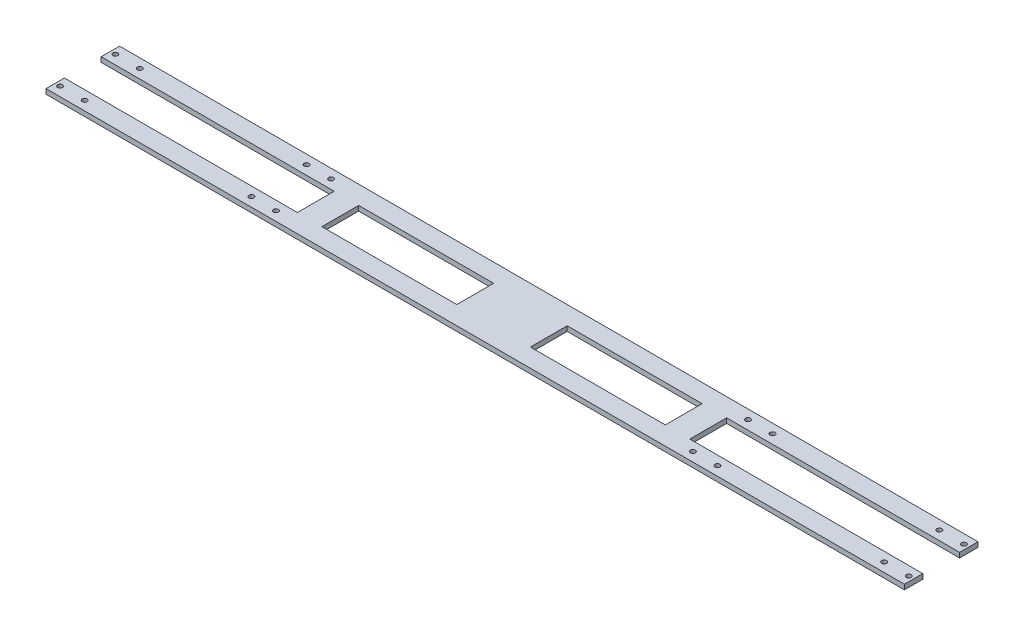
ISO-10303-21;
HEADER;
FILE_DESCRIPTION(('STEP AP214'),'2;1');
FILE_NAME('part.step','',(''),(''),'','','');
FILE_SCHEMA(('AUTOMOTIVE_DESIGN { 1 0 10303 214 1 1 1 1 }'));
ENDSEC;
DATA;
#1=APPLICATION_CONTEXT('core data for automotive mechanical design processes');
#2=APPLICATION_PROTOCOL_DEFINITION('international standard','automotive_design',2000,#1);
#3=PRODUCT_CONTEXT('',#1,'mechanical');
#4=PRODUCT('Part','Part','',(#3));
#5=PRODUCT_RELATED_PRODUCT_CATEGORY('part','',(#4));
#6=PRODUCT_DEFINITION_FORMATION('','',#4);
#7=PRODUCT_DEFINITION_CONTEXT('part definition',#1,'design');
#8=PRODUCT_DEFINITION('design','',#6,#7);
#9=PRODUCT_DEFINITION_SHAPE('','',#8);
#10=(LENGTH_UNIT() NAMED_UNIT(*) SI_UNIT(.MILLI.,.METRE.));
#11=(NAMED_UNIT(*) PLANE_ANGLE_UNIT() SI_UNIT($,.RADIAN.));
#12=(NAMED_UNIT(*) SI_UNIT($,.STERADIAN.) SOLID_ANGLE_UNIT());
#13=UNCERTAINTY_MEASURE_WITH_UNIT(LENGTH_MEASURE(1.E-05),#10,'distance_accuracy_value','');
#14=(GEOMETRIC_REPRESENTATION_CONTEXT(3) GLOBAL_UNCERTAINTY_ASSIGNED_CONTEXT((#13)) GLOBAL_UNIT_ASSIGNED_CONTEXT((#10,
#11,#12)) REPRESENTATION_CONTEXT('',''));
#15=CARTESIAN_POINT('',(0.,0.,0.));
#16=DIRECTION('',(0.,0.,1.));
#17=DIRECTION('',(1.,0.,0.));
#18=AXIS2_PLACEMENT_3D('',#15,#16,#17);
#19=CARTESIAN_POINT('',(-140.,4.,-15.));
#20=DIRECTION('',(0.,0.,1.));
#21=DIRECTION('',(1.,0.,0.));
#22=AXIS2_PLACEMENT_3D('',#19,#20,#21);
#23=PLANE('',#22);
#24=DIRECTION('',(0.,1.,0.));
#25=VECTOR('',#24,1.);
#26=CARTESIAN_POINT('',(30.,0.,-15.));
#27=LINE('',#26,#25);
#28=CARTESIAN_POINT('',(30.,0.,-15.));
#29=VERTEX_POINT('',#28);
#30=CARTESIAN_POINT('',(30.,4.,-15.));
#31=VERTEX_POINT('',#30);
#32=EDGE_CURVE('E197',#29,#31,#27,.T.);
#33=ORIENTED_EDGE('',*,*,#32,.F.);
#34=DIRECTION('',(-1.,0.,0.));
#35=VECTOR('',#34,1.);
#36=CARTESIAN_POINT('',(-140.,0.,-15.));
#37=LINE('',#36,#35);
#38=CARTESIAN_POINT('',(140.,0.,-15.));
#39=VERTEX_POINT('',#38);
#40=EDGE_CURVE('E372',#39,#29,#37,.T.);
#41=ORIENTED_EDGE('',*,*,#40,.F.);
#42=DIRECTION('',(0.,-1.,0.));
#43=VECTOR('',#42,1.);
#44=CARTESIAN_POINT('',(140.,4.,-15.));
#45=LINE('',#44,#43);
#46=CARTESIAN_POINT('',(140.,4.,-15.));
#47=VERTEX_POINT('',#46);
#48=EDGE_CURVE('E387',#47,#39,#45,.T.);
#49=ORIENTED_EDGE('',*,*,#48,.F.);
#50=DIRECTION('',(-1.,0.,0.));
#51=VECTOR('',#50,1.);
#52=CARTESIAN_POINT('',(-140.,4.,-15.));
#53=LINE('',#52,#51);
#54=EDGE_CURVE('E56',#47,#31,#53,.T.);
#55=ORIENTED_EDGE('',*,*,#54,.T.);
#56=EDGE_LOOP('',(#33,#41,#49,#55));
#57=FACE_BOUND('',#56,.T.);
#58=ADVANCED_FACE('F41',(#57),#23,.T.);
#59=CARTESIAN_POINT('',(-140.,4.,15.));
#60=DIRECTION('',(0.,0.,-1.));
#61=DIRECTION('',(-1.,0.,0.));
#62=AXIS2_PLACEMENT_3D('',#59,#60,#61);
#63=PLANE('',#62);
#64=DIRECTION('',(0.,1.,0.));
#65=VECTOR('',#64,1.);
#66=CARTESIAN_POINT('',(30.,0.,15.));
#67=LINE('',#66,#65);
#68=CARTESIAN_POINT('',(30.,0.,15.));
#69=VERTEX_POINT('',#68);
#70=CARTESIAN_POINT('',(30.,4.,15.));
#71=VERTEX_POINT('',#70);
#72=EDGE_CURVE('E211',#69,#71,#67,.T.);
#73=ORIENTED_EDGE('',*,*,#72,.T.);
#74=DIRECTION('',(1.,0.,0.));
#75=VECTOR('',#74,1.);
#76=CARTESIAN_POINT('',(-140.,4.,15.));
#77=LINE('',#76,#75);
#78=CARTESIAN_POINT('',(140.,4.,15.));
#79=VERTEX_POINT('',#78);
#80=EDGE_CURVE('E366',#71,#79,#77,.T.);
#81=ORIENTED_EDGE('',*,*,#80,.T.);
#82=DIRECTION('',(0.,-1.,0.));
#83=VECTOR('',#82,1.);
#84=CARTESIAN_POINT('',(140.,4.,15.));
#85=LINE('',#84,#83);
#86=CARTESIAN_POINT('',(140.,0.,15.));
#87=VERTEX_POINT('',#86);
#88=EDGE_CURVE('E369',#79,#87,#85,.T.);
#89=ORIENTED_EDGE('',*,*,#88,.T.);
#90=DIRECTION('',(1.,0.,0.));
#91=VECTOR('',#90,1.);
#92=CARTESIAN_POINT('',(-140.,0.,15.));
#93=LINE('',#92,#91);
#94=EDGE_CURVE('E378',#69,#87,#93,.T.);
#95=ORIENTED_EDGE('',*,*,#94,.F.);
#96=EDGE_LOOP('',(#73,#81,#89,#95));
#97=FACE_BOUND('',#96,.T.);
#98=ADVANCED_FACE('F486',(#97),#63,.T.);
#99=CARTESIAN_POINT('',(0.,4.,0.));
#100=DIRECTION('',(0.,-1.,0.));
#101=DIRECTION('',(0.,0.,-1.));
#102=AXIS2_PLACEMENT_3D('',#99,#100,#101);
#103=PLANE('',#102);
#104=CARTESIAN_POINT('',(-30.,4.,-15.));
#105=VERTEX_POINT('',#104);
#106=CARTESIAN_POINT('',(-140.,4.,-15.));
#107=VERTEX_POINT('',#106);
#108=EDGE_CURVE('E180',#105,#107,#53,.T.);
#109=ORIENTED_EDGE('',*,*,#108,.F.);
#110=DIRECTION('',(0.,0.,1.));
#111=VECTOR('',#110,1.);
#112=CARTESIAN_POINT('',(-30.,4.,15.));
#113=LINE('',#112,#111);
#114=CARTESIAN_POINT('',(-30.,4.,15.));
#115=VERTEX_POINT('',#114);
#116=EDGE_CURVE('E185',#105,#115,#113,.T.);
#117=ORIENTED_EDGE('',*,*,#116,.T.);
#118=CARTESIAN_POINT('',(-140.,4.,15.));
#119=VERTEX_POINT('',#118);
#120=EDGE_CURVE('E367',#119,#115,#77,.T.);
#121=ORIENTED_EDGE('',*,*,#120,.F.);
#122=DIRECTION('',(0.,0.,1.));
#123=VECTOR('',#122,1.);
#124=CARTESIAN_POINT('',(-140.,4.,15.));
#125=LINE('',#124,#123);
#126=EDGE_CURVE('E187',#107,#119,#125,.T.);
#127=ORIENTED_EDGE('',*,*,#126,.F.);
#128=EDGE_LOOP('',(#109,#117,#121,#127));
#129=FACE_BOUND('',#128,.T.);
#130=CARTESIAN_POINT('',(170.,4.,22.5));
#131=DIRECTION('',(0.,1.,0.));
#132=DIRECTION('',(0.,0.,-1.));
#133=AXIS2_PLACEMENT_3D('',#130,#131,#132);
#134=CIRCLE('',#133,2.);
#135=CARTESIAN_POINT('',(170.,4.,20.5));
#136=VERTEX_POINT('',#135);
#137=EDGE_CURVE('E227',#136,#136,#134,.T.);
#138=ORIENTED_EDGE('',*,*,#137,.F.);
#139=EDGE_LOOP('',(#138));
#140=FACE_BOUND('',#139,.T.);
#141=CARTESIAN_POINT('',(346.,4.,22.5));
#142=DIRECTION('',(0.,1.,0.));
#143=DIRECTION('',(0.,0.,-1.));
#144=AXIS2_PLACEMENT_3D('',#141,#142,#143);
#145=CIRCLE('',#144,2.);
#146=CARTESIAN_POINT('',(346.,4.,20.5));
#147=VERTEX_POINT('',#146);
#148=EDGE_CURVE('E220',#147,#147,#145,.T.);
#149=ORIENTED_EDGE('',*,*,#148,.F.);
#150=EDGE_LOOP('',(#149));
#151=FACE_BOUND('',#150,.T.);
#152=CARTESIAN_POINT('',(326.,4.,22.5));
#153=DIRECTION('',(0.,1.,0.));
#154=DIRECTION('',(0.,0.,-1.));
#155=AXIS2_PLACEMENT_3D('',#152,#153,#154);
#156=CIRCLE('',#155,2.);
#157=CARTESIAN_POINT('',(326.,4.,20.5));
#158=VERTEX_POINT('',#157);
#159=EDGE_CURVE('E214',#158,#158,#156,.T.);
#160=ORIENTED_EDGE('',*,*,#159,.F.);
#161=EDGE_LOOP('',(#160));
#162=FACE_BOUND('',#161,.T.);
#163=CARTESIAN_POINT('',(190.,4.,22.5));
#164=DIRECTION('',(0.,1.,0.));
#165=DIRECTION('',(0.,0.,-1.));
#166=AXIS2_PLACEMENT_3D('',#163,#164,#165);
#167=CIRCLE('',#166,2.);
#168=CARTESIAN_POINT('',(190.,4.,20.5));
#169=VERTEX_POINT('',#168);
#170=EDGE_CURVE('E226',#169,#169,#167,.T.);
#171=ORIENTED_EDGE('',*,*,#170,.F.);
#172=EDGE_LOOP('',(#171));
#173=FACE_BOUND('',#172,.T.);
#174=CARTESIAN_POINT('',(170.,4.,-22.5));
#175=DIRECTION('',(0.,-1.,0.));
#176=DIRECTION('',(0.,0.,1.));
#177=AXIS2_PLACEMENT_3D('',#174,#175,#176);
#178=CIRCLE('',#177,2.);
#179=CARTESIAN_POINT('',(170.,4.,-20.5));
#180=VERTEX_POINT('',#179);
#181=EDGE_CURVE('E251',#180,#180,#178,.T.);
#182=ORIENTED_EDGE('',*,*,#181,.T.);
#183=EDGE_LOOP('',(#182));
#184=FACE_BOUND('',#183,.T.);
#185=CARTESIAN_POINT('',(346.,4.,-22.5));
#186=DIRECTION('',(0.,-1.,0.));
#187=DIRECTION('',(0.,0.,1.));
#188=AXIS2_PLACEMENT_3D('',#185,#186,#187);
#189=CIRCLE('',#188,2.);
#190=CARTESIAN_POINT('',(346.,4.,-20.5));
#191=VERTEX_POINT('',#190);
#192=EDGE_CURVE('E244',#191,#191,#189,.T.);
#193=ORIENTED_EDGE('',*,*,#192,.T.);
#194=EDGE_LOOP('',(#193));
#195=FACE_BOUND('',#194,.T.);
#196=CARTESIAN_POINT('',(326.,4.,-22.5));
#197=DIRECTION('',(0.,-1.,0.));
#198=DIRECTION('',(0.,0.,1.));
#199=AXIS2_PLACEMENT_3D('',#196,#197,#198);
#200=CIRCLE('',#199,2.);
#201=CARTESIAN_POINT('',(326.,4.,-20.5));
#202=VERTEX_POINT('',#201);
#203=EDGE_CURVE('E238',#202,#202,#200,.T.);
#204=ORIENTED_EDGE('',*,*,#203,.T.);
#205=EDGE_LOOP('',(#204));
#206=FACE_BOUND('',#205,.T.);
#207=CARTESIAN_POINT('',(190.,4.,-22.5));
#208=DIRECTION('',(0.,-1.,0.));
#209=DIRECTION('',(0.,0.,1.));
#210=AXIS2_PLACEMENT_3D('',#207,#208,#209);
#211=CIRCLE('',#210,2.);
#212=CARTESIAN_POINT('',(190.,4.,-20.5));
#213=VERTEX_POINT('',#212);
#214=EDGE_CURVE('E250',#213,#213,#211,.T.);
#215=ORIENTED_EDGE('',*,*,#214,.T.);
#216=EDGE_LOOP('',(#215));
#217=FACE_BOUND('',#216,.T.);
#218=CARTESIAN_POINT('',(-170.,4.,22.5));
#219=DIRECTION('',(0.,-1.,0.));
#220=DIRECTION('',(0.,0.,-1.));
#221=AXIS2_PLACEMENT_3D('',#218,#219,#220);
#222=CIRCLE('',#221,2.);
#223=CARTESIAN_POINT('',(-170.,4.,20.5));
#224=VERTEX_POINT('',#223);
#225=EDGE_CURVE('E275',#224,#224,#222,.T.);
#226=ORIENTED_EDGE('',*,*,#225,.T.);
#227=EDGE_LOOP('',(#226));
#228=FACE_BOUND('',#227,.T.);
#229=CARTESIAN_POINT('',(-346.,4.,22.5));
#230=DIRECTION('',(0.,-1.,0.));
#231=DIRECTION('',(0.,0.,-1.));
#232=AXIS2_PLACEMENT_3D('',#229,#230,#231);
#233=CIRCLE('',#232,2.);
#234=CARTESIAN_POINT('',(-346.,4.,20.5));
#235=VERTEX_POINT('',#234);
#236=EDGE_CURVE('E268',#235,#235,#233,.T.);
#237=ORIENTED_EDGE('',*,*,#236,.T.);
#238=EDGE_LOOP('',(#237));
#239=FACE_BOUND('',#238,.T.);
#240=CARTESIAN_POINT('',(-326.,4.,22.5));
#241=DIRECTION('',(0.,-1.,0.));
#242=DIRECTION('',(0.,0.,-1.));
#243=AXIS2_PLACEMENT_3D('',#240,#241,#242);
#244=CIRCLE('',#243,2.);
#245=CARTESIAN_POINT('',(-326.,4.,20.5));
#246=VERTEX_POINT('',#245);
#247=EDGE_CURVE('E262',#246,#246,#244,.T.);
#248=ORIENTED_EDGE('',*,*,#247,.T.);
#249=EDGE_LOOP('',(#248));
#250=FACE_BOUND('',#249,.T.);
#251=CARTESIAN_POINT('',(-190.,4.,22.5));
#252=DIRECTION('',(0.,-1.,0.));
#253=DIRECTION('',(0.,0.,-1.));
#254=AXIS2_PLACEMENT_3D('',#251,#252,#253);
#255=CIRCLE('',#254,2.);
#256=CARTESIAN_POINT('',(-190.,4.,20.5));
#257=VERTEX_POINT('',#256);
#258=EDGE_CURVE('E274',#257,#257,#255,.T.);
#259=ORIENTED_EDGE('',*,*,#258,.T.);
#260=EDGE_LOOP('',(#259));
#261=FACE_BOUND('',#260,.T.);
#262=CARTESIAN_POINT('',(-170.,4.,-22.5));
#263=DIRECTION('',(0.,1.,0.));
#264=DIRECTION('',(0.,0.,1.));
#265=AXIS2_PLACEMENT_3D('',#262,#263,#264);
#266=CIRCLE('',#265,2.);
#267=CARTESIAN_POINT('',(-170.,4.,-20.5));
#268=VERTEX_POINT('',#267);
#269=EDGE_CURVE('E295',#268,#268,#266,.T.);
#270=ORIENTED_EDGE('',*,*,#269,.F.);
#271=EDGE_LOOP('',(#270));
#272=FACE_BOUND('',#271,.T.);
#273=CARTESIAN_POINT('',(-346.,4.,-22.5));
#274=DIRECTION('',(0.,1.,0.));
#275=DIRECTION('',(0.,0.,1.));
#276=AXIS2_PLACEMENT_3D('',#273,#274,#275);
#277=CIRCLE('',#276,2.);
#278=CARTESIAN_POINT('',(-346.,4.,-20.5));
#279=VERTEX_POINT('',#278);
#280=EDGE_CURVE('E302',#279,#279,#277,.T.);
#281=ORIENTED_EDGE('',*,*,#280,.F.);
#282=EDGE_LOOP('',(#281));
#283=FACE_BOUND('',#282,.T.);
#284=CARTESIAN_POINT('',(-326.,4.,-22.5));
#285=DIRECTION('',(0.,1.,0.));
#286=DIRECTION('',(0.,0.,1.));
#287=AXIS2_PLACEMENT_3D('',#284,#285,#286);
#288=CIRCLE('',#287,2.);
#289=CARTESIAN_POINT('',(-326.,4.,-20.5));
#290=VERTEX_POINT('',#289);
#291=EDGE_CURVE('E289',#290,#290,#288,.T.);
#292=ORIENTED_EDGE('',*,*,#291,.F.);
#293=EDGE_LOOP('',(#292));
#294=FACE_BOUND('',#293,.T.);
#295=CARTESIAN_POINT('',(-190.,4.,-22.5));
#296=DIRECTION('',(0.,1.,0.));
#297=DIRECTION('',(0.,0.,1.));
#298=AXIS2_PLACEMENT_3D('',#295,#296,#297);
#299=CIRCLE('',#298,2.);
#300=CARTESIAN_POINT('',(-190.,4.,-20.5));
#301=VERTEX_POINT('',#300);
#302=EDGE_CURVE('E298',#301,#301,#299,.T.);
#303=ORIENTED_EDGE('',*,*,#302,.F.);
#304=EDGE_LOOP('',(#303));
#305=FACE_BOUND('',#304,.T.);
#306=DIRECTION('',(0.,0.,-1.));
#307=VECTOR('',#306,1.);
#308=CARTESIAN_POINT('',(140.,4.,15.));
#309=LINE('',#308,#307);
#310=EDGE_CURVE('E189',#79,#47,#309,.T.);
#311=ORIENTED_EDGE('',*,*,#310,.F.);
#312=ORIENTED_EDGE('',*,*,#80,.F.);
#313=DIRECTION('',(0.,0.,-1.));
#314=VECTOR('',#313,1.);
#315=CARTESIAN_POINT('',(30.,4.,15.));
#316=LINE('',#315,#314);
#317=EDGE_CURVE('E202',#71,#31,#316,.T.);
#318=ORIENTED_EDGE('',*,*,#317,.T.);
#319=ORIENTED_EDGE('',*,*,#54,.F.);
#320=EDGE_LOOP('',(#311,#312,#318,#319));
#321=FACE_BOUND('',#320,.T.);
#322=DIRECTION('',(-1.,0.,0.));
#323=VECTOR('',#322,1.);
#324=CARTESIAN_POINT('',(350.,4.,15.));
#325=LINE('',#324,#323);
#326=CARTESIAN_POINT('',(350.,4.,15.));
#327=VERTEX_POINT('',#326);
#328=CARTESIAN_POINT('',(160.,4.,15.));
#329=VERTEX_POINT('',#328);
#330=EDGE_CURVE('E316',#327,#329,#325,.T.);
#331=ORIENTED_EDGE('',*,*,#330,.T.);
#332=DIRECTION('',(0.,0.,-1.));
#333=VECTOR('',#332,1.);
#334=CARTESIAN_POINT('',(160.,4.,-15.));
#335=LINE('',#334,#333);
#336=CARTESIAN_POINT('',(160.,4.,-15.));
#337=VERTEX_POINT('',#336);
#338=EDGE_CURVE('E323',#329,#337,#335,.T.);
#339=ORIENTED_EDGE('',*,*,#338,.T.);
#340=DIRECTION('',(1.,0.,0.));
#341=VECTOR('',#340,1.);
#342=CARTESIAN_POINT('',(350.,4.,-15.));
#343=LINE('',#342,#341);
#344=CARTESIAN_POINT('',(350.,4.,-15.));
#345=VERTEX_POINT('',#344);
#346=EDGE_CURVE('E310',#337,#345,#343,.T.);
#347=ORIENTED_EDGE('',*,*,#346,.T.);
#348=DIRECTION('',(0.,0.,-1.));
#349=VECTOR('',#348,1.);
#350=CARTESIAN_POINT('',(350.,4.,30.));
#351=LINE('',#350,#349);
#352=CARTESIAN_POINT('',(350.,4.,-30.));
#353=VERTEX_POINT('',#352);
#354=EDGE_CURVE('E395',#345,#353,#351,.T.);
#355=ORIENTED_EDGE('',*,*,#354,.T.);
#356=DIRECTION('',(-1.,0.,0.));
#357=VECTOR('',#356,1.);
#358=CARTESIAN_POINT('',(-350.,4.,-30.));
#359=LINE('',#358,#357);
#360=CARTESIAN_POINT('',(-350.,4.,-30.));
#361=VERTEX_POINT('',#360);
#362=EDGE_CURVE('E394',#353,#361,#359,.T.);
#363=ORIENTED_EDGE('',*,*,#362,.T.);
#364=DIRECTION('',(0.,0.,1.));
#365=VECTOR('',#364,1.);
#366=CARTESIAN_POINT('',(-350.,4.,30.));
#367=LINE('',#366,#365);
#368=CARTESIAN_POINT('',(-350.,4.,-15.));
#369=VERTEX_POINT('',#368);
#370=EDGE_CURVE('E398',#361,#369,#367,.T.);
#371=ORIENTED_EDGE('',*,*,#370,.T.);
#372=DIRECTION('',(-1.,0.,0.));
#373=VECTOR('',#372,1.);
#374=CARTESIAN_POINT('',(-350.,4.,-15.));
#375=LINE('',#374,#373);
#376=CARTESIAN_POINT('',(-160.,4.,-15.));
#377=VERTEX_POINT('',#376);
#378=EDGE_CURVE('E341',#377,#369,#375,.T.);
#379=ORIENTED_EDGE('',*,*,#378,.F.);
#380=DIRECTION('',(0.,0.,-1.));
#381=VECTOR('',#380,1.);
#382=CARTESIAN_POINT('',(-160.,4.,-15.));
#383=LINE('',#382,#381);
#384=CARTESIAN_POINT('',(-160.,4.,15.));
#385=VERTEX_POINT('',#384);
#386=EDGE_CURVE('E350',#385,#377,#383,.T.);
#387=ORIENTED_EDGE('',*,*,#386,.F.);
#388=DIRECTION('',(1.,0.,0.));
#389=VECTOR('',#388,1.);
#390=CARTESIAN_POINT('',(-350.,4.,15.));
#391=LINE('',#390,#389);
#392=CARTESIAN_POINT('',(-350.,4.,15.));
#393=VERTEX_POINT('',#392);
#394=EDGE_CURVE('E331',#393,#385,#391,.T.);
#395=ORIENTED_EDGE('',*,*,#394,.F.);
#396=CARTESIAN_POINT('',(-350.,4.,30.));
#397=VERTEX_POINT('',#396);
#398=EDGE_CURVE('E397',#393,#397,#367,.T.);
#399=ORIENTED_EDGE('',*,*,#398,.T.);
#400=DIRECTION('',(1.,0.,0.));
#401=VECTOR('',#400,1.);
#402=CARTESIAN_POINT('',(-350.,4.,30.));
#403=LINE('',#402,#401);
#404=CARTESIAN_POINT('',(350.,4.,30.));
#405=VERTEX_POINT('',#404);
#406=EDGE_CURVE('E401',#397,#405,#403,.T.);
#407=ORIENTED_EDGE('',*,*,#406,.T.);
#408=EDGE_CURVE('E391',#405,#327,#351,.T.);
#409=ORIENTED_EDGE('',*,*,#408,.T.);
#410=EDGE_LOOP('',(#331,#339,#347,#355,#363,#371,#379,#387,#395,#399,#407,#409));
#411=FACE_BOUND('',#410,.T.);
#412=ADVANCED_FACE('F181',(#129,#140,#151,#162,#173,#184,#195,#206,#217,#228,#239,#250,#261,
#272,#283,#294,#305,#321,#411),#103,.F.);
#413=CARTESIAN_POINT('',(0.,0.,0.));
#414=DIRECTION('',(0.,-1.,0.));
#415=DIRECTION('',(0.,0.,-1.));
#416=AXIS2_PLACEMENT_3D('',#413,#414,#415);
#417=PLANE('',#416);
#418=DIRECTION('',(0.,0.,1.));
#419=VECTOR('',#418,1.);
#420=CARTESIAN_POINT('',(-30.,0.,15.));
#421=LINE('',#420,#419);
#422=CARTESIAN_POINT('',(-30.,0.,-15.));
#423=VERTEX_POINT('',#422);
#424=CARTESIAN_POINT('',(-30.,0.,15.));
#425=VERTEX_POINT('',#424);
#426=EDGE_CURVE('E205',#423,#425,#421,.T.);
#427=ORIENTED_EDGE('',*,*,#426,.F.);
#428=CARTESIAN_POINT('',(-140.,0.,-15.));
#429=VERTEX_POINT('',#428);
#430=EDGE_CURVE('E64',#423,#429,#37,.T.);
#431=ORIENTED_EDGE('',*,*,#430,.T.);
#432=DIRECTION('',(0.,0.,1.));
#433=VECTOR('',#432,1.);
#434=CARTESIAN_POINT('',(-140.,0.,15.));
#435=LINE('',#434,#433);
#436=CARTESIAN_POINT('',(-140.,0.,15.));
#437=VERTEX_POINT('',#436);
#438=EDGE_CURVE('E375',#429,#437,#435,.T.);
#439=ORIENTED_EDGE('',*,*,#438,.T.);
#440=EDGE_CURVE('E363',#437,#425,#93,.T.);
#441=ORIENTED_EDGE('',*,*,#440,.T.);
#442=EDGE_LOOP('',(#427,#431,#439,#441));
#443=FACE_BOUND('',#442,.T.);
#444=CARTESIAN_POINT('',(170.,0.,22.5));
#445=DIRECTION('',(0.,1.,0.));
#446=DIRECTION('',(0.,0.,-1.));
#447=AXIS2_PLACEMENT_3D('',#444,#445,#446);
#448=CIRCLE('',#447,2.);
#449=CARTESIAN_POINT('',(170.,0.,20.5));
#450=VERTEX_POINT('',#449);
#451=EDGE_CURVE('E223',#450,#450,#448,.T.);
#452=ORIENTED_EDGE('',*,*,#451,.T.);
#453=EDGE_LOOP('',(#452));
#454=FACE_BOUND('',#453,.T.);
#455=CARTESIAN_POINT('',(346.,0.,22.5));
#456=DIRECTION('',(0.,1.,0.));
#457=DIRECTION('',(0.,0.,-1.));
#458=AXIS2_PLACEMENT_3D('',#455,#456,#457);
#459=CIRCLE('',#458,2.);
#460=CARTESIAN_POINT('',(346.,0.,20.5));
#461=VERTEX_POINT('',#460);
#462=EDGE_CURVE('E230',#461,#461,#459,.T.);
#463=ORIENTED_EDGE('',*,*,#462,.T.);
#464=EDGE_LOOP('',(#463));
#465=FACE_BOUND('',#464,.T.);
#466=CARTESIAN_POINT('',(326.,0.,22.5));
#467=DIRECTION('',(0.,1.,0.));
#468=DIRECTION('',(0.,0.,-1.));
#469=AXIS2_PLACEMENT_3D('',#466,#467,#468);
#470=CIRCLE('',#469,2.);
#471=CARTESIAN_POINT('',(326.,0.,20.5));
#472=VERTEX_POINT('',#471);
#473=EDGE_CURVE('E217',#472,#472,#470,.T.);
#474=ORIENTED_EDGE('',*,*,#473,.T.);
#475=EDGE_LOOP('',(#474));
#476=FACE_BOUND('',#475,.T.);
#477=CARTESIAN_POINT('',(190.,0.,22.5));
#478=DIRECTION('',(0.,1.,0.));
#479=DIRECTION('',(0.,0.,-1.));
#480=AXIS2_PLACEMENT_3D('',#477,#478,#479);
#481=CIRCLE('',#480,2.);
#482=CARTESIAN_POINT('',(190.,0.,20.5));
#483=VERTEX_POINT('',#482);
#484=EDGE_CURVE('E235',#483,#483,#481,.T.);
#485=ORIENTED_EDGE('',*,*,#484,.T.);
#486=EDGE_LOOP('',(#485));
#487=FACE_BOUND('',#486,.T.);
#488=CARTESIAN_POINT('',(170.,0.,-22.5));
#489=DIRECTION('',(0.,-1.,0.));
#490=DIRECTION('',(0.,0.,1.));
#491=AXIS2_PLACEMENT_3D('',#488,#489,#490);
#492=CIRCLE('',#491,2.);
#493=CARTESIAN_POINT('',(170.,0.,-20.5));
#494=VERTEX_POINT('',#493);
#495=EDGE_CURVE('E247',#494,#494,#492,.T.);
#496=ORIENTED_EDGE('',*,*,#495,.F.);
#497=EDGE_LOOP('',(#496));
#498=FACE_BOUND('',#497,.T.);
#499=CARTESIAN_POINT('',(346.,0.,-22.5));
#500=DIRECTION('',(0.,-1.,0.));
#501=DIRECTION('',(0.,0.,1.));
#502=AXIS2_PLACEMENT_3D('',#499,#500,#501);
#503=CIRCLE('',#502,2.);
#504=CARTESIAN_POINT('',(346.,0.,-20.5));
#505=VERTEX_POINT('',#504);
#506=EDGE_CURVE('E254',#505,#505,#503,.T.);
#507=ORIENTED_EDGE('',*,*,#506,.F.);
#508=EDGE_LOOP('',(#507));
#509=FACE_BOUND('',#508,.T.);
#510=CARTESIAN_POINT('',(326.,0.,-22.5));
#511=DIRECTION('',(0.,-1.,0.));
#512=DIRECTION('',(0.,0.,1.));
#513=AXIS2_PLACEMENT_3D('',#510,#511,#512);
#514=CIRCLE('',#513,2.);
#515=CARTESIAN_POINT('',(326.,0.,-20.5));
#516=VERTEX_POINT('',#515);
#517=EDGE_CURVE('E241',#516,#516,#514,.T.);
#518=ORIENTED_EDGE('',*,*,#517,.F.);
#519=EDGE_LOOP('',(#518));
#520=FACE_BOUND('',#519,.T.);
#521=CARTESIAN_POINT('',(190.,0.,-22.5));
#522=DIRECTION('',(0.,-1.,0.));
#523=DIRECTION('',(0.,0.,1.));
#524=AXIS2_PLACEMENT_3D('',#521,#522,#523);
#525=CIRCLE('',#524,2.);
#526=CARTESIAN_POINT('',(190.,0.,-20.5));
#527=VERTEX_POINT('',#526);
#528=EDGE_CURVE('E259',#527,#527,#525,.T.);
#529=ORIENTED_EDGE('',*,*,#528,.F.);
#530=EDGE_LOOP('',(#529));
#531=FACE_BOUND('',#530,.T.);
#532=CARTESIAN_POINT('',(-170.,0.,22.5));
#533=DIRECTION('',(0.,-1.,0.));
#534=DIRECTION('',(0.,0.,-1.));
#535=AXIS2_PLACEMENT_3D('',#532,#533,#534);
#536=CIRCLE('',#535,2.);
#537=CARTESIAN_POINT('',(-170.,0.,20.5));
#538=VERTEX_POINT('',#537);
#539=EDGE_CURVE('E271',#538,#538,#536,.T.);
#540=ORIENTED_EDGE('',*,*,#539,.F.);
#541=EDGE_LOOP('',(#540));
#542=FACE_BOUND('',#541,.T.);
#543=CARTESIAN_POINT('',(-346.,0.,22.5));
#544=DIRECTION('',(0.,-1.,0.));
#545=DIRECTION('',(0.,0.,-1.));
#546=AXIS2_PLACEMENT_3D('',#543,#544,#545);
#547=CIRCLE('',#546,2.);
#548=CARTESIAN_POINT('',(-346.,0.,20.5));
#549=VERTEX_POINT('',#548);
#550=EDGE_CURVE('E278',#549,#549,#547,.T.);
#551=ORIENTED_EDGE('',*,*,#550,.F.);
#552=EDGE_LOOP('',(#551));
#553=FACE_BOUND('',#552,.T.);
#554=CARTESIAN_POINT('',(-326.,0.,22.5));
#555=DIRECTION('',(0.,-1.,0.));
#556=DIRECTION('',(0.,0.,-1.));
#557=AXIS2_PLACEMENT_3D('',#554,#555,#556);
#558=CIRCLE('',#557,2.);
#559=CARTESIAN_POINT('',(-326.,0.,20.5));
#560=VERTEX_POINT('',#559);
#561=EDGE_CURVE('E265',#560,#560,#558,.T.);
#562=ORIENTED_EDGE('',*,*,#561,.F.);
#563=EDGE_LOOP('',(#562));
#564=FACE_BOUND('',#563,.T.);
#565=CARTESIAN_POINT('',(-190.,0.,22.5));
#566=DIRECTION('',(0.,-1.,0.));
#567=DIRECTION('',(0.,0.,-1.));
#568=AXIS2_PLACEMENT_3D('',#565,#566,#567);
#569=CIRCLE('',#568,2.);
#570=CARTESIAN_POINT('',(-190.,0.,20.5));
#571=VERTEX_POINT('',#570);
#572=EDGE_CURVE('E283',#571,#571,#569,.T.);
#573=ORIENTED_EDGE('',*,*,#572,.F.);
#574=EDGE_LOOP('',(#573));
#575=FACE_BOUND('',#574,.T.);
#576=CARTESIAN_POINT('',(-170.,0.,-22.5));
#577=DIRECTION('',(0.,1.,0.));
#578=DIRECTION('',(0.,0.,1.));
#579=AXIS2_PLACEMENT_3D('',#576,#577,#578);
#580=CIRCLE('',#579,2.);
#581=CARTESIAN_POINT('',(-170.,0.,-20.5));
#582=VERTEX_POINT('',#581);
#583=EDGE_CURVE('E299',#582,#582,#580,.T.);
#584=ORIENTED_EDGE('',*,*,#583,.T.);
#585=EDGE_LOOP('',(#584));
#586=FACE_BOUND('',#585,.T.);
#587=CARTESIAN_POINT('',(-346.,0.,-22.5));
#588=DIRECTION('',(0.,1.,0.));
#589=DIRECTION('',(0.,0.,1.));
#590=AXIS2_PLACEMENT_3D('',#587,#588,#589);
#591=CIRCLE('',#590,2.);
#592=CARTESIAN_POINT('',(-346.,0.,-20.5));
#593=VERTEX_POINT('',#592);
#594=EDGE_CURVE('E292',#593,#593,#591,.T.);
#595=ORIENTED_EDGE('',*,*,#594,.T.);
#596=EDGE_LOOP('',(#595));
#597=FACE_BOUND('',#596,.T.);
#598=CARTESIAN_POINT('',(-326.,0.,-22.5));
#599=DIRECTION('',(0.,1.,0.));
#600=DIRECTION('',(0.,0.,1.));
#601=AXIS2_PLACEMENT_3D('',#598,#599,#600);
#602=CIRCLE('',#601,2.);
#603=CARTESIAN_POINT('',(-326.,0.,-20.5));
#604=VERTEX_POINT('',#603);
#605=EDGE_CURVE('E286',#604,#604,#602,.T.);
#606=ORIENTED_EDGE('',*,*,#605,.T.);
#607=EDGE_LOOP('',(#606));
#608=FACE_BOUND('',#607,.T.);
#609=CARTESIAN_POINT('',(-190.,0.,-22.5));
#610=DIRECTION('',(0.,1.,0.));
#611=DIRECTION('',(0.,0.,1.));
#612=AXIS2_PLACEMENT_3D('',#609,#610,#611);
#613=CIRCLE('',#612,2.);
#614=CARTESIAN_POINT('',(-190.,0.,-20.5));
#615=VERTEX_POINT('',#614);
#616=EDGE_CURVE('E307',#615,#615,#613,.T.);
#617=ORIENTED_EDGE('',*,*,#616,.T.);
#618=EDGE_LOOP('',(#617));
#619=FACE_BOUND('',#618,.T.);
#620=ORIENTED_EDGE('',*,*,#40,.T.);
#621=DIRECTION('',(0.,0.,-1.));
#622=VECTOR('',#621,1.);
#623=CARTESIAN_POINT('',(30.,0.,15.));
#624=LINE('',#623,#622);
#625=EDGE_CURVE('E201',#69,#29,#624,.T.);
#626=ORIENTED_EDGE('',*,*,#625,.F.);
#627=ORIENTED_EDGE('',*,*,#94,.T.);
#628=DIRECTION('',(0.,0.,-1.));
#629=VECTOR('',#628,1.);
#630=CARTESIAN_POINT('',(140.,0.,15.));
#631=LINE('',#630,#629);
#632=EDGE_CURVE('E357',#87,#39,#631,.T.);
#633=ORIENTED_EDGE('',*,*,#632,.T.);
#634=EDGE_LOOP('',(#620,#626,#627,#633));
#635=FACE_BOUND('',#634,.T.);
#636=DIRECTION('',(0.,0.,-1.));
#637=VECTOR('',#636,1.);
#638=CARTESIAN_POINT('',(160.,0.,-15.));
#639=LINE('',#638,#637);
#640=CARTESIAN_POINT('',(160.,0.,15.));
#641=VERTEX_POINT('',#640);
#642=CARTESIAN_POINT('',(160.,0.,-15.));
#643=VERTEX_POINT('',#642);
#644=EDGE_CURVE('E315',#641,#643,#639,.T.);
#645=ORIENTED_EDGE('',*,*,#644,.F.);
#646=DIRECTION('',(-1.,0.,0.));
#647=VECTOR('',#646,1.);
#648=CARTESIAN_POINT('',(350.,0.,15.));
#649=LINE('',#648,#647);
#650=CARTESIAN_POINT('',(350.,0.,15.));
#651=VERTEX_POINT('',#650);
#652=EDGE_CURVE('E318',#651,#641,#649,.T.);
#653=ORIENTED_EDGE('',*,*,#652,.F.);
#654=DIRECTION('',(0.,0.,-1.));
#655=VECTOR('',#654,1.);
#656=CARTESIAN_POINT('',(350.,0.,30.));
#657=LINE('',#656,#655);
#658=CARTESIAN_POINT('',(350.,0.,30.));
#659=VERTEX_POINT('',#658);
#660=EDGE_CURVE('E404',#659,#651,#657,.T.);
#661=ORIENTED_EDGE('',*,*,#660,.F.);
#662=DIRECTION('',(1.,0.,0.));
#663=VECTOR('',#662,1.);
#664=CARTESIAN_POINT('',(-350.,0.,30.));
#665=LINE('',#664,#663);
#666=CARTESIAN_POINT('',(-350.,0.,30.));
#667=VERTEX_POINT('',#666);
#668=EDGE_CURVE('E413',#667,#659,#665,.T.);
#669=ORIENTED_EDGE('',*,*,#668,.F.);
#670=DIRECTION('',(0.,0.,1.));
#671=VECTOR('',#670,1.);
#672=CARTESIAN_POINT('',(-350.,0.,30.));
#673=LINE('',#672,#671);
#674=CARTESIAN_POINT('',(-350.,0.,15.));
#675=VERTEX_POINT('',#674);
#676=EDGE_CURVE('E409',#675,#667,#673,.T.);
#677=ORIENTED_EDGE('',*,*,#676,.F.);
#678=DIRECTION('',(1.,0.,0.));
#679=VECTOR('',#678,1.);
#680=CARTESIAN_POINT('',(-350.,0.,15.));
#681=LINE('',#680,#679);
#682=CARTESIAN_POINT('',(-160.,0.,15.));
#683=VERTEX_POINT('',#682);
#684=EDGE_CURVE('E337',#675,#683,#681,.T.);
#685=ORIENTED_EDGE('',*,*,#684,.T.);
#686=DIRECTION('',(0.,0.,-1.));
#687=VECTOR('',#686,1.);
#688=CARTESIAN_POINT('',(-160.,0.,-15.));
#689=LINE('',#688,#687);
#690=CARTESIAN_POINT('',(-160.,0.,-15.));
#691=VERTEX_POINT('',#690);
#692=EDGE_CURVE('E340',#683,#691,#689,.T.);
#693=ORIENTED_EDGE('',*,*,#692,.T.);
#694=DIRECTION('',(-1.,0.,0.));
#695=VECTOR('',#694,1.);
#696=CARTESIAN_POINT('',(-350.,0.,-15.));
#697=LINE('',#696,#695);
#698=CARTESIAN_POINT('',(-350.,0.,-15.));
#699=VERTEX_POINT('',#698);
#700=EDGE_CURVE('E344',#691,#699,#697,.T.);
#701=ORIENTED_EDGE('',*,*,#700,.T.);
#702=CARTESIAN_POINT('',(-350.,0.,-30.));
#703=VERTEX_POINT('',#702);
#704=EDGE_CURVE('E410',#703,#699,#673,.T.);
#705=ORIENTED_EDGE('',*,*,#704,.F.);
#706=DIRECTION('',(-1.,0.,0.));
#707=VECTOR('',#706,1.);
#708=CARTESIAN_POINT('',(-350.,0.,-30.));
#709=LINE('',#708,#707);
#710=CARTESIAN_POINT('',(350.,0.,-30.));
#711=VERTEX_POINT('',#710);
#712=EDGE_CURVE('E407',#711,#703,#709,.T.);
#713=ORIENTED_EDGE('',*,*,#712,.F.);
#714=CARTESIAN_POINT('',(350.,0.,-15.));
#715=VERTEX_POINT('',#714);
#716=EDGE_CURVE('E390',#715,#711,#657,.T.);
#717=ORIENTED_EDGE('',*,*,#716,.F.);
#718=DIRECTION('',(1.,0.,0.));
#719=VECTOR('',#718,1.);
#720=CARTESIAN_POINT('',(350.,0.,-15.));
#721=LINE('',#720,#719);
#722=EDGE_CURVE('E313',#643,#715,#721,.T.);
#723=ORIENTED_EDGE('',*,*,#722,.F.);
#724=EDGE_LOOP('',(#645,#653,#661,#669,#677,#685,#693,#701,#705,#713,#717,#723));
#725=FACE_BOUND('',#724,.T.);
#726=ADVANCED_FACE('F430',(#443,#454,#465,#476,#487,#498,#509,#520,#531,#542,#553,#564,#575,
#586,#597,#608,#619,#635,#725),#417,.T.);
#727=CARTESIAN_POINT('',(350.,4.,30.));
#728=DIRECTION('',(-1.,0.,0.));
#729=DIRECTION('',(0.,0.,1.));
#730=AXIS2_PLACEMENT_3D('',#727,#728,#729);
#731=PLANE('',#730);
#732=DIRECTION('',(0.,1.,0.));
#733=VECTOR('',#732,1.);
#734=CARTESIAN_POINT('',(350.,0.,15.));
#735=LINE('',#734,#733);
#736=EDGE_CURVE('E328',#651,#327,#735,.T.);
#737=ORIENTED_EDGE('',*,*,#736,.T.);
#738=ORIENTED_EDGE('',*,*,#408,.F.);
#739=DIRECTION('',(0.,-1.,0.));
#740=VECTOR('',#739,1.);
#741=CARTESIAN_POINT('',(350.,4.,30.));
#742=LINE('',#741,#740);
#743=EDGE_CURVE('E403',#405,#659,#742,.T.);
#744=ORIENTED_EDGE('',*,*,#743,.T.);
#745=ORIENTED_EDGE('',*,*,#660,.T.);
#746=EDGE_LOOP('',(#737,#738,#744,#745));
#747=FACE_BOUND('',#746,.T.);
#748=ADVANCED_FACE('F43',(#747),#731,.F.);
#749=DIRECTION('',(0.,1.,0.));
#750=VECTOR('',#749,1.);
#751=CARTESIAN_POINT('',(350.,0.,-15.));
#752=LINE('',#751,#750);
#753=EDGE_CURVE('E320',#715,#345,#752,.T.);
#754=ORIENTED_EDGE('',*,*,#753,.F.);
#755=ORIENTED_EDGE('',*,*,#716,.T.);
#756=DIRECTION('',(0.,-1.,0.));
#757=VECTOR('',#756,1.);
#758=CARTESIAN_POINT('',(350.,4.,-30.));
#759=LINE('',#758,#757);
#760=EDGE_CURVE('E11',#353,#711,#759,.T.);
#761=ORIENTED_EDGE('',*,*,#760,.F.);
#762=ORIENTED_EDGE('',*,*,#354,.F.);
#763=EDGE_LOOP('',(#754,#755,#761,#762));
#764=FACE_BOUND('',#763,.T.);
#765=ADVANCED_FACE('F444',(#764),#731,.F.);
#766=CARTESIAN_POINT('',(-350.,4.,30.));
#767=DIRECTION('',(1.,0.,0.));
#768=DIRECTION('',(0.,0.,-1.));
#769=AXIS2_PLACEMENT_3D('',#766,#767,#768);
#770=PLANE('',#769);
#771=ORIENTED_EDGE('',*,*,#704,.T.);
#772=DIRECTION('',(0.,1.,0.));
#773=VECTOR('',#772,1.);
#774=CARTESIAN_POINT('',(-350.,0.,-15.));
#775=LINE('',#774,#773);
#776=EDGE_CURVE('E354',#699,#369,#775,.T.);
#777=ORIENTED_EDGE('',*,*,#776,.T.);
#778=ORIENTED_EDGE('',*,*,#370,.F.);
#779=DIRECTION('',(0.,-1.,0.));
#780=VECTOR('',#779,1.);
#781=CARTESIAN_POINT('',(-350.,4.,-30.));
#782=LINE('',#781,#780);
#783=EDGE_CURVE('E49',#361,#703,#782,.T.);
#784=ORIENTED_EDGE('',*,*,#783,.T.);
#785=EDGE_LOOP('',(#771,#777,#778,#784));
#786=FACE_BOUND('',#785,.T.);
#787=ADVANCED_FACE('F424',(#786),#770,.F.);
#788=CARTESIAN_POINT('',(-350.,4.,-30.));
#789=DIRECTION('',(0.,0.,1.));
#790=DIRECTION('',(1.,0.,0.));
#791=AXIS2_PLACEMENT_3D('',#788,#789,#790);
#792=PLANE('',#791);
#793=ORIENTED_EDGE('',*,*,#712,.T.);
#794=ORIENTED_EDGE('',*,*,#783,.F.);
#795=ORIENTED_EDGE('',*,*,#362,.F.);
#796=ORIENTED_EDGE('',*,*,#760,.T.);
#797=EDGE_LOOP('',(#793,#794,#795,#796));
#798=FACE_BOUND('',#797,.T.);
#799=ADVANCED_FACE('F441',(#798),#792,.F.);
#800=ORIENTED_EDGE('',*,*,#398,.F.);
#801=DIRECTION('',(0.,1.,0.));
#802=VECTOR('',#801,1.);
#803=CARTESIAN_POINT('',(-350.,0.,15.));
#804=LINE('',#803,#802);
#805=EDGE_CURVE('E347',#675,#393,#804,.T.);
#806=ORIENTED_EDGE('',*,*,#805,.F.);
#807=ORIENTED_EDGE('',*,*,#676,.T.);
#808=DIRECTION('',(0.,-1.,0.));
#809=VECTOR('',#808,1.);
#810=CARTESIAN_POINT('',(-350.,4.,30.));
#811=LINE('',#810,#809);
#812=EDGE_CURVE('E417',#397,#667,#811,.T.);
#813=ORIENTED_EDGE('',*,*,#812,.F.);
#814=EDGE_LOOP('',(#800,#806,#807,#813));
#815=FACE_BOUND('',#814,.T.);
#816=ADVANCED_FACE('F470',(#815),#770,.F.);
#817=CARTESIAN_POINT('',(-350.,4.,30.));
#818=DIRECTION('',(0.,0.,-1.));
#819=DIRECTION('',(-1.,0.,0.));
#820=AXIS2_PLACEMENT_3D('',#817,#818,#819);
#821=PLANE('',#820);
#822=ORIENTED_EDGE('',*,*,#668,.T.);
#823=ORIENTED_EDGE('',*,*,#743,.F.);
#824=ORIENTED_EDGE('',*,*,#406,.F.);
#825=ORIENTED_EDGE('',*,*,#812,.T.);
#826=EDGE_LOOP('',(#822,#823,#824,#825));
#827=FACE_BOUND('',#826,.T.);
#828=ADVANCED_FACE('F464',(#827),#821,.F.);
#829=CARTESIAN_POINT('',(140.,4.,15.));
#830=DIRECTION('',(-1.,0.,0.));
#831=DIRECTION('',(0.,0.,1.));
#832=AXIS2_PLACEMENT_3D('',#829,#830,#831);
#833=PLANE('',#832);
#834=ORIENTED_EDGE('',*,*,#632,.F.);
#835=ORIENTED_EDGE('',*,*,#88,.F.);
#836=ORIENTED_EDGE('',*,*,#310,.T.);
#837=ORIENTED_EDGE('',*,*,#48,.T.);
#838=EDGE_LOOP('',(#834,#835,#836,#837));
#839=FACE_BOUND('',#838,.T.);
#840=ADVANCED_FACE('F498',(#839),#833,.T.);
#841=DIRECTION('',(0.,1.,0.));
#842=VECTOR('',#841,1.);
#843=CARTESIAN_POINT('',(-30.,0.,-15.));
#844=LINE('',#843,#842);
#845=EDGE_CURVE('E191',#423,#105,#844,.T.);
#846=ORIENTED_EDGE('',*,*,#845,.T.);
#847=ORIENTED_EDGE('',*,*,#108,.T.);
#848=DIRECTION('',(0.,-1.,0.));
#849=VECTOR('',#848,1.);
#850=CARTESIAN_POINT('',(-140.,4.,-15.));
#851=LINE('',#850,#849);
#852=EDGE_CURVE('E385',#107,#429,#851,.T.);
#853=ORIENTED_EDGE('',*,*,#852,.T.);
#854=ORIENTED_EDGE('',*,*,#430,.F.);
#855=EDGE_LOOP('',(#846,#847,#853,#854));
#856=FACE_BOUND('',#855,.T.);
#857=ADVANCED_FACE('F192',(#856),#23,.T.);
#858=CARTESIAN_POINT('',(-140.,4.,15.));
#859=DIRECTION('',(1.,0.,0.));
#860=DIRECTION('',(0.,0.,-1.));
#861=AXIS2_PLACEMENT_3D('',#858,#859,#860);
#862=PLANE('',#861);
#863=ORIENTED_EDGE('',*,*,#438,.F.);
#864=ORIENTED_EDGE('',*,*,#852,.F.);
#865=ORIENTED_EDGE('',*,*,#126,.T.);
#866=DIRECTION('',(0.,-1.,0.));
#867=VECTOR('',#866,1.);
#868=CARTESIAN_POINT('',(-140.,4.,15.));
#869=LINE('',#868,#867);
#870=EDGE_CURVE('E383',#119,#437,#869,.T.);
#871=ORIENTED_EDGE('',*,*,#870,.T.);
#872=EDGE_LOOP('',(#863,#864,#865,#871));
#873=FACE_BOUND('',#872,.T.);
#874=ADVANCED_FACE('F497',(#873),#862,.T.);
#875=DIRECTION('',(0.,1.,0.));
#876=VECTOR('',#875,1.);
#877=CARTESIAN_POINT('',(-30.,0.,15.));
#878=LINE('',#877,#876);
#879=EDGE_CURVE('E196',#425,#115,#878,.T.);
#880=ORIENTED_EDGE('',*,*,#879,.F.);
#881=ORIENTED_EDGE('',*,*,#440,.F.);
#882=ORIENTED_EDGE('',*,*,#870,.F.);
#883=ORIENTED_EDGE('',*,*,#120,.T.);
#884=EDGE_LOOP('',(#880,#881,#882,#883));
#885=FACE_BOUND('',#884,.T.);
#886=ADVANCED_FACE('F483',(#885),#63,.T.);
#887=CARTESIAN_POINT('',(-350.,0.,-15.));
#888=DIRECTION('',(0.,0.,-1.));
#889=DIRECTION('',(-1.,0.,0.));
#890=AXIS2_PLACEMENT_3D('',#887,#888,#889);
#891=PLANE('',#890);
#892=ORIENTED_EDGE('',*,*,#378,.T.);
#893=ORIENTED_EDGE('',*,*,#776,.F.);
#894=ORIENTED_EDGE('',*,*,#700,.F.);
#895=DIRECTION('',(0.,1.,0.));
#896=VECTOR('',#895,1.);
#897=CARTESIAN_POINT('',(-160.,0.,-15.));
#898=LINE('',#897,#896);
#899=EDGE_CURVE('E358',#691,#377,#898,.T.);
#900=ORIENTED_EDGE('',*,*,#899,.T.);
#901=EDGE_LOOP('',(#892,#893,#894,#900));
#902=FACE_BOUND('',#901,.T.);
#903=ADVANCED_FACE('F435',(#902),#891,.F.);
#904=CARTESIAN_POINT('',(-160.,0.,-15.));
#905=DIRECTION('',(1.,0.,0.));
#906=DIRECTION('',(0.,0.,-1.));
#907=AXIS2_PLACEMENT_3D('',#904,#905,#906);
#908=PLANE('',#907);
#909=ORIENTED_EDGE('',*,*,#386,.T.);
#910=ORIENTED_EDGE('',*,*,#899,.F.);
#911=ORIENTED_EDGE('',*,*,#692,.F.);
#912=DIRECTION('',(0.,1.,0.));
#913=VECTOR('',#912,1.);
#914=CARTESIAN_POINT('',(-160.,0.,15.));
#915=LINE('',#914,#913);
#916=EDGE_CURVE('E360',#683,#385,#915,.T.);
#917=ORIENTED_EDGE('',*,*,#916,.T.);
#918=EDGE_LOOP('',(#909,#910,#911,#917));
#919=FACE_BOUND('',#918,.T.);
#920=ADVANCED_FACE('F475',(#919),#908,.F.);
#921=CARTESIAN_POINT('',(-350.,0.,15.));
#922=DIRECTION('',(0.,0.,1.));
#923=DIRECTION('',(1.,0.,0.));
#924=AXIS2_PLACEMENT_3D('',#921,#922,#923);
#925=PLANE('',#924);
#926=ORIENTED_EDGE('',*,*,#394,.T.);
#927=ORIENTED_EDGE('',*,*,#916,.F.);
#928=ORIENTED_EDGE('',*,*,#684,.F.);
#929=ORIENTED_EDGE('',*,*,#805,.T.);
#930=EDGE_LOOP('',(#926,#927,#928,#929));
#931=FACE_BOUND('',#930,.T.);
#932=ADVANCED_FACE('F473',(#931),#925,.F.);
#933=CARTESIAN_POINT('',(350.,0.,15.));
#934=DIRECTION('',(0.,0.,-1.));
#935=DIRECTION('',(-1.,0.,0.));
#936=AXIS2_PLACEMENT_3D('',#933,#934,#935);
#937=PLANE('',#936);
#938=ORIENTED_EDGE('',*,*,#330,.F.);
#939=ORIENTED_EDGE('',*,*,#736,.F.);
#940=ORIENTED_EDGE('',*,*,#652,.T.);
#941=DIRECTION('',(0.,1.,0.));
#942=VECTOR('',#941,1.);
#943=CARTESIAN_POINT('',(160.,0.,15.));
#944=LINE('',#943,#942);
#945=EDGE_CURVE('E332',#641,#329,#944,.T.);
#946=ORIENTED_EDGE('',*,*,#945,.T.);
#947=EDGE_LOOP('',(#938,#939,#940,#946));
#948=FACE_BOUND('',#947,.T.);
#949=ADVANCED_FACE('F456',(#948),#937,.T.);
#950=CARTESIAN_POINT('',(160.,0.,-15.));
#951=DIRECTION('',(1.,0.,0.));
#952=DIRECTION('',(0.,0.,-1.));
#953=AXIS2_PLACEMENT_3D('',#950,#951,#952);
#954=PLANE('',#953);
#955=ORIENTED_EDGE('',*,*,#338,.F.);
#956=ORIENTED_EDGE('',*,*,#945,.F.);
#957=ORIENTED_EDGE('',*,*,#644,.T.);
#958=DIRECTION('',(0.,1.,0.));
#959=VECTOR('',#958,1.);
#960=CARTESIAN_POINT('',(160.,0.,-15.));
#961=LINE('',#960,#959);
#962=EDGE_CURVE('E334',#643,#337,#961,.T.);
#963=ORIENTED_EDGE('',*,*,#962,.T.);
#964=EDGE_LOOP('',(#955,#956,#957,#963));
#965=FACE_BOUND('',#964,.T.);
#966=ADVANCED_FACE('F453',(#965),#954,.T.);
#967=CARTESIAN_POINT('',(350.,0.,-15.));
#968=DIRECTION('',(0.,0.,1.));
#969=DIRECTION('',(1.,0.,0.));
#970=AXIS2_PLACEMENT_3D('',#967,#968,#969);
#971=PLANE('',#970);
#972=ORIENTED_EDGE('',*,*,#346,.F.);
#973=ORIENTED_EDGE('',*,*,#962,.F.);
#974=ORIENTED_EDGE('',*,*,#722,.T.);
#975=ORIENTED_EDGE('',*,*,#753,.T.);
#976=EDGE_LOOP('',(#972,#973,#974,#975));
#977=FACE_BOUND('',#976,.T.);
#978=ADVANCED_FACE('F450',(#977),#971,.T.);
#979=CARTESIAN_POINT('',(-190.,0.,-22.5));
#980=DIRECTION('',(0.,1.,0.));
#981=DIRECTION('',(0.,0.,1.));
#982=AXIS2_PLACEMENT_3D('',#979,#980,#981);
#983=CYLINDRICAL_SURFACE('',#982,2.);
#984=ORIENTED_EDGE('',*,*,#616,.F.);
#985=EDGE_LOOP('',(#984));
#986=FACE_BOUND('',#985,.T.);
#987=ORIENTED_EDGE('',*,*,#302,.T.);
#988=EDGE_LOOP('',(#987));
#989=FACE_BOUND('',#988,.T.);
#990=ADVANCED_FACE('F582',(#986,#989),#983,.F.);
#991=CARTESIAN_POINT('',(-326.,0.,-22.5));
#992=DIRECTION('',(0.,1.,0.));
#993=DIRECTION('',(0.,0.,1.));
#994=AXIS2_PLACEMENT_3D('',#991,#992,#993);
#995=CYLINDRICAL_SURFACE('',#994,2.);
#996=ORIENTED_EDGE('',*,*,#605,.F.);
#997=EDGE_LOOP('',(#996));
#998=FACE_BOUND('',#997,.T.);
#999=ORIENTED_EDGE('',*,*,#291,.T.);
#1000=EDGE_LOOP('',(#999));
#1001=FACE_BOUND('',#1000,.T.);
#1002=ADVANCED_FACE('F591',(#998,#1001),#995,.F.);
#1003=CARTESIAN_POINT('',(-346.,0.,-22.5));
#1004=DIRECTION('',(0.,1.,0.));
#1005=DIRECTION('',(0.,0.,1.));
#1006=AXIS2_PLACEMENT_3D('',#1003,#1004,#1005);
#1007=CYLINDRICAL_SURFACE('',#1006,2.);
#1008=ORIENTED_EDGE('',*,*,#594,.F.);
#1009=EDGE_LOOP('',(#1008));
#1010=FACE_BOUND('',#1009,.T.);
#1011=ORIENTED_EDGE('',*,*,#280,.T.);
#1012=EDGE_LOOP('',(#1011));
#1013=FACE_BOUND('',#1012,.T.);
#1014=ADVANCED_FACE('F601',(#1010,#1013),#1007,.F.);
#1015=CARTESIAN_POINT('',(-170.,0.,-22.5));
#1016=DIRECTION('',(0.,1.,0.));
#1017=DIRECTION('',(0.,0.,1.));
#1018=AXIS2_PLACEMENT_3D('',#1015,#1016,#1017);
#1019=CYLINDRICAL_SURFACE('',#1018,2.);
#1020=ORIENTED_EDGE('',*,*,#583,.F.);
#1021=EDGE_LOOP('',(#1020));
#1022=FACE_BOUND('',#1021,.T.);
#1023=ORIENTED_EDGE('',*,*,#269,.T.);
#1024=EDGE_LOOP('',(#1023));
#1025=FACE_BOUND('',#1024,.T.);
#1026=ADVANCED_FACE('F611',(#1022,#1025),#1019,.F.);
#1027=CARTESIAN_POINT('',(-190.,0.,22.5));
#1028=DIRECTION('',(0.,1.,0.));
#1029=DIRECTION('',(0.,0.,1.));
#1030=AXIS2_PLACEMENT_3D('',#1027,#1028,#1029);
#1031=CYLINDRICAL_SURFACE('',#1030,2.);
#1032=ORIENTED_EDGE('',*,*,#572,.T.);
#1033=EDGE_LOOP('',(#1032));
#1034=FACE_BOUND('',#1033,.T.);
#1035=ORIENTED_EDGE('',*,*,#258,.F.);
#1036=EDGE_LOOP('',(#1035));
#1037=FACE_BOUND('',#1036,.T.);
#1038=ADVANCED_FACE('F621',(#1034,#1037),#1031,.F.);
#1039=CARTESIAN_POINT('',(-326.,0.,22.5));
#1040=DIRECTION('',(0.,1.,0.));
#1041=DIRECTION('',(0.,0.,1.));
#1042=AXIS2_PLACEMENT_3D('',#1039,#1040,#1041);
#1043=CYLINDRICAL_SURFACE('',#1042,2.);
#1044=ORIENTED_EDGE('',*,*,#561,.T.);
#1045=EDGE_LOOP('',(#1044));
#1046=FACE_BOUND('',#1045,.T.);
#1047=ORIENTED_EDGE('',*,*,#247,.F.);
#1048=EDGE_LOOP('',(#1047));
#1049=FACE_BOUND('',#1048,.T.);
#1050=ADVANCED_FACE('F631',(#1046,#1049),#1043,.F.);
#1051=CARTESIAN_POINT('',(-346.,0.,22.5));
#1052=DIRECTION('',(0.,1.,0.));
#1053=DIRECTION('',(0.,0.,1.));
#1054=AXIS2_PLACEMENT_3D('',#1051,#1052,#1053);
#1055=CYLINDRICAL_SURFACE('',#1054,2.);
#1056=ORIENTED_EDGE('',*,*,#550,.T.);
#1057=EDGE_LOOP('',(#1056));
#1058=FACE_BOUND('',#1057,.T.);
#1059=ORIENTED_EDGE('',*,*,#236,.F.);
#1060=EDGE_LOOP('',(#1059));
#1061=FACE_BOUND('',#1060,.T.);
#1062=ADVANCED_FACE('F641',(#1058,#1061),#1055,.F.);
#1063=CARTESIAN_POINT('',(-170.,0.,22.5));
#1064=DIRECTION('',(0.,1.,0.));
#1065=DIRECTION('',(0.,0.,1.));
#1066=AXIS2_PLACEMENT_3D('',#1063,#1064,#1065);
#1067=CYLINDRICAL_SURFACE('',#1066,2.);
#1068=ORIENTED_EDGE('',*,*,#539,.T.);
#1069=EDGE_LOOP('',(#1068));
#1070=FACE_BOUND('',#1069,.T.);
#1071=ORIENTED_EDGE('',*,*,#225,.F.);
#1072=EDGE_LOOP('',(#1071));
#1073=FACE_BOUND('',#1072,.T.);
#1074=ADVANCED_FACE('F651',(#1070,#1073),#1067,.F.);
#1075=CARTESIAN_POINT('',(190.,0.,-22.5));
#1076=DIRECTION('',(0.,1.,0.));
#1077=DIRECTION('',(0.,0.,1.));
#1078=AXIS2_PLACEMENT_3D('',#1075,#1076,#1077);
#1079=CYLINDRICAL_SURFACE('',#1078,2.);
#1080=ORIENTED_EDGE('',*,*,#528,.T.);
#1081=EDGE_LOOP('',(#1080));
#1082=FACE_BOUND('',#1081,.T.);
#1083=ORIENTED_EDGE('',*,*,#214,.F.);
#1084=EDGE_LOOP('',(#1083));
#1085=FACE_BOUND('',#1084,.T.);
#1086=ADVANCED_FACE('F661',(#1082,#1085),#1079,.F.);
#1087=CARTESIAN_POINT('',(326.,0.,-22.5));
#1088=DIRECTION('',(0.,1.,0.));
#1089=DIRECTION('',(0.,0.,1.));
#1090=AXIS2_PLACEMENT_3D('',#1087,#1088,#1089);
#1091=CYLINDRICAL_SURFACE('',#1090,2.);
#1092=ORIENTED_EDGE('',*,*,#517,.T.);
#1093=EDGE_LOOP('',(#1092));
#1094=FACE_BOUND('',#1093,.T.);
#1095=ORIENTED_EDGE('',*,*,#203,.F.);
#1096=EDGE_LOOP('',(#1095));
#1097=FACE_BOUND('',#1096,.T.);
#1098=ADVANCED_FACE('F671',(#1094,#1097),#1091,.F.);
#1099=CARTESIAN_POINT('',(346.,0.,-22.5));
#1100=DIRECTION('',(0.,1.,0.));
#1101=DIRECTION('',(0.,0.,1.));
#1102=AXIS2_PLACEMENT_3D('',#1099,#1100,#1101);
#1103=CYLINDRICAL_SURFACE('',#1102,2.);
#1104=ORIENTED_EDGE('',*,*,#506,.T.);
#1105=EDGE_LOOP('',(#1104));
#1106=FACE_BOUND('',#1105,.T.);
#1107=ORIENTED_EDGE('',*,*,#192,.F.);
#1108=EDGE_LOOP('',(#1107));
#1109=FACE_BOUND('',#1108,.T.);
#1110=ADVANCED_FACE('F681',(#1106,#1109),#1103,.F.);
#1111=CARTESIAN_POINT('',(170.,0.,-22.5));
#1112=DIRECTION('',(0.,1.,0.));
#1113=DIRECTION('',(0.,0.,1.));
#1114=AXIS2_PLACEMENT_3D('',#1111,#1112,#1113);
#1115=CYLINDRICAL_SURFACE('',#1114,2.);
#1116=ORIENTED_EDGE('',*,*,#495,.T.);
#1117=EDGE_LOOP('',(#1116));
#1118=FACE_BOUND('',#1117,.T.);
#1119=ORIENTED_EDGE('',*,*,#181,.F.);
#1120=EDGE_LOOP('',(#1119));
#1121=FACE_BOUND('',#1120,.T.);
#1122=ADVANCED_FACE('F691',(#1118,#1121),#1115,.F.);
#1123=CARTESIAN_POINT('',(190.,0.,22.5));
#1124=DIRECTION('',(0.,1.,0.));
#1125=DIRECTION('',(0.,0.,1.));
#1126=AXIS2_PLACEMENT_3D('',#1123,#1124,#1125);
#1127=CYLINDRICAL_SURFACE('',#1126,2.);
#1128=ORIENTED_EDGE('',*,*,#484,.F.);
#1129=EDGE_LOOP('',(#1128));
#1130=FACE_BOUND('',#1129,.T.);
#1131=ORIENTED_EDGE('',*,*,#170,.T.);
#1132=EDGE_LOOP('',(#1131));
#1133=FACE_BOUND('',#1132,.T.);
#1134=ADVANCED_FACE('F701',(#1130,#1133),#1127,.F.);
#1135=CARTESIAN_POINT('',(326.,0.,22.5));
#1136=DIRECTION('',(0.,1.,0.));
#1137=DIRECTION('',(0.,0.,1.));
#1138=AXIS2_PLACEMENT_3D('',#1135,#1136,#1137);
#1139=CYLINDRICAL_SURFACE('',#1138,2.);
#1140=ORIENTED_EDGE('',*,*,#473,.F.);
#1141=EDGE_LOOP('',(#1140));
#1142=FACE_BOUND('',#1141,.T.);
#1143=ORIENTED_EDGE('',*,*,#159,.T.);
#1144=EDGE_LOOP('',(#1143));
#1145=FACE_BOUND('',#1144,.T.);
#1146=ADVANCED_FACE('F711',(#1142,#1145),#1139,.F.);
#1147=CARTESIAN_POINT('',(346.,0.,22.5));
#1148=DIRECTION('',(0.,1.,0.));
#1149=DIRECTION('',(0.,0.,1.));
#1150=AXIS2_PLACEMENT_3D('',#1147,#1148,#1149);
#1151=CYLINDRICAL_SURFACE('',#1150,2.);
#1152=ORIENTED_EDGE('',*,*,#462,.F.);
#1153=EDGE_LOOP('',(#1152));
#1154=FACE_BOUND('',#1153,.T.);
#1155=ORIENTED_EDGE('',*,*,#148,.T.);
#1156=EDGE_LOOP('',(#1155));
#1157=FACE_BOUND('',#1156,.T.);
#1158=ADVANCED_FACE('F721',(#1154,#1157),#1151,.F.);
#1159=CARTESIAN_POINT('',(170.,0.,22.5));
#1160=DIRECTION('',(0.,1.,0.));
#1161=DIRECTION('',(0.,0.,1.));
#1162=AXIS2_PLACEMENT_3D('',#1159,#1160,#1161);
#1163=CYLINDRICAL_SURFACE('',#1162,2.);
#1164=ORIENTED_EDGE('',*,*,#451,.F.);
#1165=EDGE_LOOP('',(#1164));
#1166=FACE_BOUND('',#1165,.T.);
#1167=ORIENTED_EDGE('',*,*,#137,.T.);
#1168=EDGE_LOOP('',(#1167));
#1169=FACE_BOUND('',#1168,.T.);
#1170=ADVANCED_FACE('F731',(#1166,#1169),#1163,.F.);
#1171=CARTESIAN_POINT('',(30.,0.,15.));
#1172=DIRECTION('',(1.,0.,0.));
#1173=DIRECTION('',(0.,0.,-1.));
#1174=AXIS2_PLACEMENT_3D('',#1171,#1172,#1173);
#1175=PLANE('',#1174);
#1176=ORIENTED_EDGE('',*,*,#317,.F.);
#1177=ORIENTED_EDGE('',*,*,#72,.F.);
#1178=ORIENTED_EDGE('',*,*,#625,.T.);
#1179=ORIENTED_EDGE('',*,*,#32,.T.);
#1180=EDGE_LOOP('',(#1176,#1177,#1178,#1179));
#1181=FACE_BOUND('',#1180,.T.);
#1182=ADVANCED_FACE('F740',(#1181),#1175,.T.);
#1183=CARTESIAN_POINT('',(-30.,0.,15.));
#1184=DIRECTION('',(-1.,0.,0.));
#1185=DIRECTION('',(0.,0.,1.));
#1186=AXIS2_PLACEMENT_3D('',#1183,#1184,#1185);
#1187=PLANE('',#1186);
#1188=ORIENTED_EDGE('',*,*,#116,.F.);
#1189=ORIENTED_EDGE('',*,*,#845,.F.);
#1190=ORIENTED_EDGE('',*,*,#426,.T.);
#1191=ORIENTED_EDGE('',*,*,#879,.T.);
#1192=EDGE_LOOP('',(#1188,#1189,#1190,#1191));
#1193=FACE_BOUND('',#1192,.T.);
#1194=ADVANCED_FACE('F200',(#1193),#1187,.T.);
#1195=CLOSED_SHELL('',(#58,#98,#412,#726,#748,#765,#787,#799,#816,#828,#840,#857,#874,#886,#903,
#920,#932,#949,#966,#978,#990,#1002,#1014,#1026,#1038,#1050,#1062,#1074,#1086,#1098,#1110,#1122,
#1134,#1146,#1158,#1170,#1182,#1194));
#1196=MANIFOLD_SOLID_BREP('B2',#1195);
#1197=ADVANCED_BREP_SHAPE_REPRESENTATION('',(#18,#1196),#14);
#1198=SHAPE_DEFINITION_REPRESENTATION(#9,#1197);
ENDSEC;
END-ISO-10303-21;
